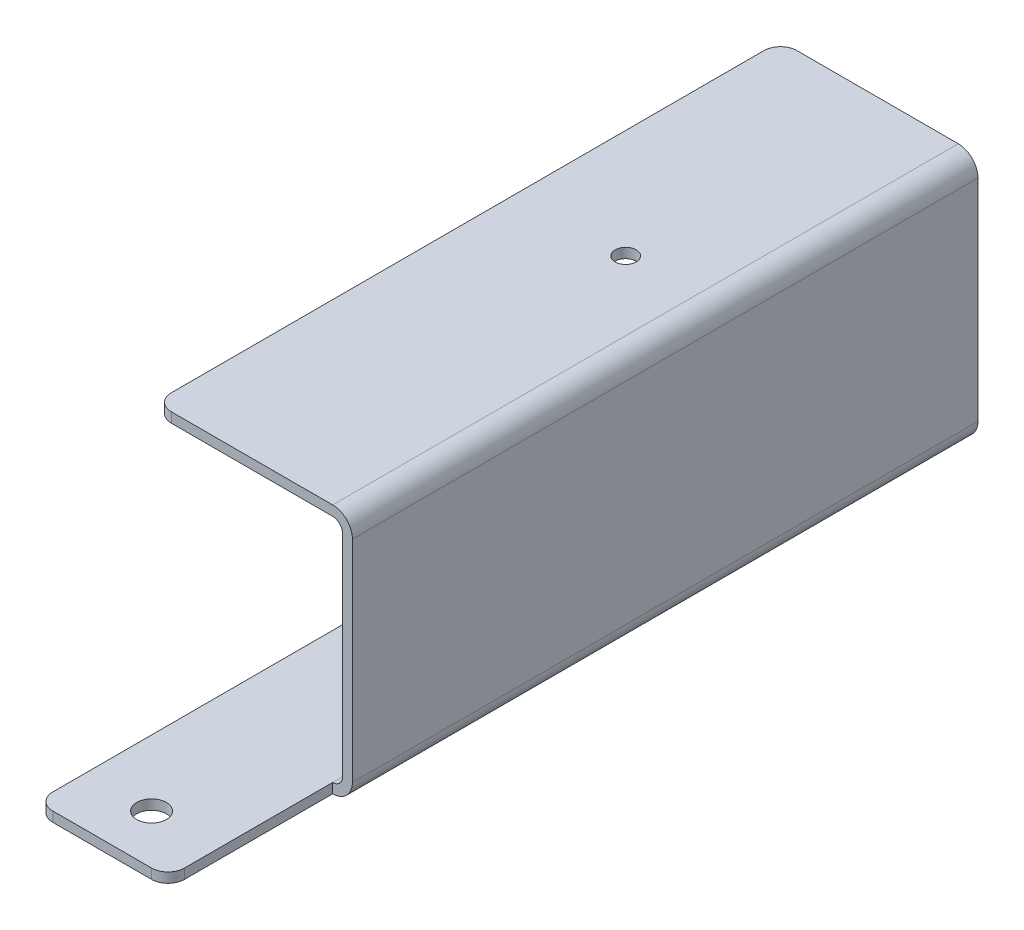
ISO-10303-21;
HEADER;
FILE_DESCRIPTION(('STEP AP214'),'2;1');
FILE_NAME('part.step','',(''),(''),'','','');
FILE_SCHEMA(('AUTOMOTIVE_DESIGN { 1 0 10303 214 1 1 1 1 }'));
ENDSEC;
DATA;
#1=APPLICATION_CONTEXT('core data for automotive mechanical design processes');
#2=APPLICATION_PROTOCOL_DEFINITION('international standard','automotive_design',2000,#1);
#3=PRODUCT_CONTEXT('',#1,'mechanical');
#4=PRODUCT('Part','Part','',(#3));
#5=PRODUCT_RELATED_PRODUCT_CATEGORY('part','',(#4));
#6=PRODUCT_DEFINITION_FORMATION('','',#4);
#7=PRODUCT_DEFINITION_CONTEXT('part definition',#1,'design');
#8=PRODUCT_DEFINITION('design','',#6,#7);
#9=PRODUCT_DEFINITION_SHAPE('','',#8);
#10=(LENGTH_UNIT() NAMED_UNIT(*) SI_UNIT(.MILLI.,.METRE.));
#11=(NAMED_UNIT(*) PLANE_ANGLE_UNIT() SI_UNIT($,.RADIAN.));
#12=(NAMED_UNIT(*) SI_UNIT($,.STERADIAN.) SOLID_ANGLE_UNIT());
#13=UNCERTAINTY_MEASURE_WITH_UNIT(LENGTH_MEASURE(1.E-05),#10,'distance_accuracy_value','');
#14=(GEOMETRIC_REPRESENTATION_CONTEXT(3) GLOBAL_UNCERTAINTY_ASSIGNED_CONTEXT((#13)) GLOBAL_UNIT_ASSIGNED_CONTEXT((#10,
#11,#12)) REPRESENTATION_CONTEXT('',''));
#15=CARTESIAN_POINT('',(0.,0.,0.));
#16=DIRECTION('',(0.,0.,1.));
#17=DIRECTION('',(1.,0.,0.));
#18=AXIS2_PLACEMENT_3D('',#15,#16,#17);
#19=CARTESIAN_POINT('',(13.,0.,-60.));
#20=DIRECTION('',(0.,0.,1.));
#21=DIRECTION('',(-1.,0.,0.));
#22=AXIS2_PLACEMENT_3D('',#19,#20,#21);
#23=PLANE('',#22);
#24=DIRECTION('',(1.,0.,0.));
#25=VECTOR('',#24,1.);
#26=CARTESIAN_POINT('',(11.5000000000001,33.5,-60.));
#27=LINE('',#26,#25);
#28=CARTESIAN_POINT('',(11.5000000000001,33.5,-60.));
#29=VERTEX_POINT('',#28);
#30=CARTESIAN_POINT('',(13.0000000000001,33.5,-60.));
#31=VERTEX_POINT('',#30);
#32=EDGE_CURVE('E306',#29,#31,#27,.T.);
#33=ORIENTED_EDGE('',*,*,#32,.T.);
#34=DIRECTION('',(0.,-1.,0.));
#35=VECTOR('',#34,1.);
#36=CARTESIAN_POINT('',(13.,0.,-60.));
#37=LINE('',#36,#35);
#38=CARTESIAN_POINT('',(13.,1.49999999999999,-60.));
#39=VERTEX_POINT('',#38);
#40=EDGE_CURVE('E314',#31,#39,#37,.T.);
#41=ORIENTED_EDGE('',*,*,#40,.T.);
#42=DIRECTION('',(-1.,0.,0.));
#43=VECTOR('',#42,1.);
#44=CARTESIAN_POINT('',(13.,1.49999999999999,-60.));
#45=LINE('',#44,#43);
#46=CARTESIAN_POINT('',(11.5,1.49999999999999,-60.));
#47=VERTEX_POINT('',#46);
#48=EDGE_CURVE('E313',#47,#39,#45,.F.);
#49=ORIENTED_EDGE('',*,*,#48,.F.);
#50=DIRECTION('',(0.,1.,0.));
#51=VECTOR('',#50,1.);
#52=CARTESIAN_POINT('',(11.5,0.,-60.));
#53=LINE('',#52,#51);
#54=EDGE_CURVE('E318',#29,#47,#53,.F.);
#55=ORIENTED_EDGE('',*,*,#54,.F.);
#56=EDGE_LOOP('',(#33,#41,#49,#55));
#57=FACE_BOUND('',#56,.T.);
#58=ADVANCED_FACE('F41',(#57),#23,.F.);
#59=CARTESIAN_POINT('',(13.,0.,0.));
#60=DIRECTION('',(-1.,0.,0.));
#61=DIRECTION('',(0.,1.,0.));
#62=AXIS2_PLACEMENT_3D('',#59,#60,#61);
#63=PLANE('',#62);
#64=DIRECTION('',(0.,0.,1.));
#65=VECTOR('',#64,1.);
#66=CARTESIAN_POINT('',(13.,1.49999999999999,-60.));
#67=LINE('',#66,#65);
#68=CARTESIAN_POINT('',(13.0000000000001,1.5,35.));
#69=VERTEX_POINT('',#68);
#70=EDGE_CURVE('E321',#69,#39,#67,.F.);
#71=ORIENTED_EDGE('',*,*,#70,.T.);
#72=ORIENTED_EDGE('',*,*,#40,.F.);
#73=DIRECTION('',(0.,0.,1.));
#74=VECTOR('',#73,1.);
#75=CARTESIAN_POINT('',(13.0000000000001,33.5,60.));
#76=LINE('',#75,#74);
#77=CARTESIAN_POINT('',(13.0000000000001,33.5,35.));
#78=VERTEX_POINT('',#77);
#79=EDGE_CURVE('E299',#78,#31,#76,.F.);
#80=ORIENTED_EDGE('',*,*,#79,.F.);
#81=DIRECTION('',(0.,1.,0.));
#82=VECTOR('',#81,1.);
#83=CARTESIAN_POINT('',(13.0000000000001,0.,35.));
#84=LINE('',#83,#82);
#85=EDGE_CURVE('E258',#69,#78,#84,.T.);
#86=ORIENTED_EDGE('',*,*,#85,.F.);
#87=EDGE_LOOP('',(#71,#72,#80,#86));
#88=FACE_BOUND('',#87,.T.);
#89=ADVANCED_FACE('F460',(#88),#63,.F.);
#90=CARTESIAN_POINT('',(11.5,0.,0.));
#91=DIRECTION('',(-1.,0.,0.));
#92=DIRECTION('',(0.,1.,0.));
#93=AXIS2_PLACEMENT_3D('',#90,#91,#92);
#94=PLANE('',#93);
#95=DIRECTION('',(0.,1.,0.));
#96=VECTOR('',#95,1.);
#97=CARTESIAN_POINT('',(11.5,0.,35.));
#98=LINE('',#97,#96);
#99=CARTESIAN_POINT('',(11.5,1.49999999999999,35.));
#100=VERTEX_POINT('',#99);
#101=CARTESIAN_POINT('',(11.5000000000001,33.5,35.));
#102=VERTEX_POINT('',#101);
#103=EDGE_CURVE('E268',#100,#102,#98,.T.);
#104=ORIENTED_EDGE('',*,*,#103,.T.);
#105=DIRECTION('',(0.,0.,1.));
#106=VECTOR('',#105,1.);
#107=CARTESIAN_POINT('',(11.5000000000001,33.5,60.));
#108=LINE('',#107,#106);
#109=EDGE_CURVE('E295',#102,#29,#108,.F.);
#110=ORIENTED_EDGE('',*,*,#109,.T.);
#111=ORIENTED_EDGE('',*,*,#54,.T.);
#112=DIRECTION('',(0.,0.,1.));
#113=VECTOR('',#112,1.);
#114=CARTESIAN_POINT('',(11.5,1.49999999999999,-60.));
#115=LINE('',#114,#113);
#116=EDGE_CURVE('E324',#47,#100,#115,.T.);
#117=ORIENTED_EDGE('',*,*,#116,.T.);
#118=EDGE_LOOP('',(#104,#110,#111,#117));
#119=FACE_BOUND('',#118,.T.);
#120=ADVANCED_FACE('F435',(#119),#94,.T.);
#121=CARTESIAN_POINT('',(-10.,-1.5,60.));
#122=DIRECTION('',(-1.,0.,0.));
#123=DIRECTION('',(0.,0.,-1.));
#124=AXIS2_PLACEMENT_3D('',#121,#122,#123);
#125=PLANE('',#124);
#126=DIRECTION('',(0.,0.,-1.));
#127=VECTOR('',#126,1.);
#128=CARTESIAN_POINT('',(-10.,0.,60.));
#129=LINE('',#128,#127);
#130=CARTESIAN_POINT('',(-10.,0.,57.5));
#131=VERTEX_POINT('',#130);
#132=CARTESIAN_POINT('',(-10.,0.,-60.));
#133=VERTEX_POINT('',#132);
#134=EDGE_CURVE('E352',#131,#133,#129,.T.);
#135=ORIENTED_EDGE('',*,*,#134,.T.);
#136=DIRECTION('',(0.,1.,0.));
#137=VECTOR('',#136,1.);
#138=CARTESIAN_POINT('',(-10.,-1.5,-60.));
#139=LINE('',#138,#137);
#140=CARTESIAN_POINT('',(-10.,-1.5,-60.));
#141=VERTEX_POINT('',#140);
#142=EDGE_CURVE('E346',#141,#133,#139,.T.);
#143=ORIENTED_EDGE('',*,*,#142,.F.);
#144=DIRECTION('',(0.,0.,-1.));
#145=VECTOR('',#144,1.);
#146=CARTESIAN_POINT('',(-10.,-1.5,60.));
#147=LINE('',#146,#145);
#148=CARTESIAN_POINT('',(-10.,-1.5,57.5));
#149=VERTEX_POINT('',#148);
#150=EDGE_CURVE('E340',#149,#141,#147,.T.);
#151=ORIENTED_EDGE('',*,*,#150,.F.);
#152=DIRECTION('',(0.,1.,0.));
#153=VECTOR('',#152,1.);
#154=CARTESIAN_POINT('',(-10.,-1.5,57.5));
#155=LINE('',#154,#153);
#156=EDGE_CURVE('E377',#131,#149,#155,.F.);
#157=ORIENTED_EDGE('',*,*,#156,.F.);
#158=EDGE_LOOP('',(#135,#143,#151,#157));
#159=FACE_BOUND('',#158,.T.);
#160=ADVANCED_FACE('F486',(#159),#125,.T.);
#161=CARTESIAN_POINT('',(-10.,-1.5,60.));
#162=DIRECTION('',(0.,0.,1.));
#163=DIRECTION('',(-1.,0.,0.));
#164=AXIS2_PLACEMENT_3D('',#161,#162,#163);
#165=PLANE('',#164);
#166=DIRECTION('',(-1.,0.,0.));
#167=VECTOR('',#166,1.);
#168=CARTESIAN_POINT('',(-10.,0.,60.));
#169=LINE('',#168,#167);
#170=CARTESIAN_POINT('',(7.5,0.,60.));
#171=VERTEX_POINT('',#170);
#172=CARTESIAN_POINT('',(-7.5,0.,60.));
#173=VERTEX_POINT('',#172);
#174=EDGE_CURVE('E349',#171,#173,#169,.T.);
#175=ORIENTED_EDGE('',*,*,#174,.T.);
#176=DIRECTION('',(0.,1.,0.));
#177=VECTOR('',#176,1.);
#178=CARTESIAN_POINT('',(-7.5,-1.5,60.));
#179=LINE('',#178,#177);
#180=CARTESIAN_POINT('',(-7.5,-1.5,60.));
#181=VERTEX_POINT('',#180);
#182=EDGE_CURVE('E366',#181,#173,#179,.T.);
#183=ORIENTED_EDGE('',*,*,#182,.F.);
#184=DIRECTION('',(-1.,0.,0.));
#185=VECTOR('',#184,1.);
#186=CARTESIAN_POINT('',(-10.,-1.5,60.));
#187=LINE('',#186,#185);
#188=CARTESIAN_POINT('',(7.5,-1.5,60.));
#189=VERTEX_POINT('',#188);
#190=EDGE_CURVE('E336',#189,#181,#187,.T.);
#191=ORIENTED_EDGE('',*,*,#190,.F.);
#192=DIRECTION('',(0.,1.,0.));
#193=VECTOR('',#192,1.);
#194=CARTESIAN_POINT('',(7.5,-1.5,60.));
#195=LINE('',#194,#193);
#196=EDGE_CURVE('E369',#171,#189,#195,.F.);
#197=ORIENTED_EDGE('',*,*,#196,.F.);
#198=EDGE_LOOP('',(#175,#183,#191,#197));
#199=FACE_BOUND('',#198,.T.);
#200=ADVANCED_FACE('F481',(#199),#165,.T.);
#201=CARTESIAN_POINT('',(0.,-1.5,0.));
#202=DIRECTION('',(0.,1.,0.));
#203=DIRECTION('',(0.,0.,1.));
#204=AXIS2_PLACEMENT_3D('',#201,#202,#203);
#205=PLANE('',#204);
#206=CARTESIAN_POINT('',(0.,-1.5,52.5));
#207=DIRECTION('',(0.,-1.,0.));
#208=DIRECTION('',(0.,0.,1.));
#209=AXIS2_PLACEMENT_3D('',#206,#207,#208);
#210=CIRCLE('',#209,2.25);
#211=CARTESIAN_POINT('',(0.,-1.5,54.75));
#212=VERTEX_POINT('',#211);
#213=EDGE_CURVE('E245',#212,#212,#210,.T.);
#214=ORIENTED_EDGE('',*,*,#213,.F.);
#215=EDGE_LOOP('',(#214));
#216=FACE_BOUND('',#215,.T.);
#217=ORIENTED_EDGE('',*,*,#190,.T.);
#218=CARTESIAN_POINT('',(-7.5,-1.5,57.5));
#219=DIRECTION('',(0.,-1.,0.));
#220=DIRECTION('',(0.,0.,1.));
#221=AXIS2_PLACEMENT_3D('',#218,#219,#220);
#222=CIRCLE('',#221,2.5);
#223=EDGE_CURVE('E372',#149,#181,#222,.F.);
#224=ORIENTED_EDGE('',*,*,#223,.F.);
#225=ORIENTED_EDGE('',*,*,#150,.T.);
#226=DIRECTION('',(1.,0.,0.));
#227=VECTOR('',#226,1.);
#228=CARTESIAN_POINT('',(-10.,-1.5,-60.));
#229=LINE('',#228,#227);
#230=CARTESIAN_POINT('',(10.,-1.50000000000002,-60.));
#231=VERTEX_POINT('',#230);
#232=EDGE_CURVE('E343',#141,#231,#229,.T.);
#233=ORIENTED_EDGE('',*,*,#232,.T.);
#234=DIRECTION('',(0.,0.,1.));
#235=VECTOR('',#234,1.);
#236=CARTESIAN_POINT('',(10.,-1.5,60.));
#237=LINE('',#236,#235);
#238=CARTESIAN_POINT('',(10.,-1.5,35.));
#239=VERTEX_POINT('',#238);
#240=EDGE_CURVE('E333',#231,#239,#237,.T.);
#241=ORIENTED_EDGE('',*,*,#240,.T.);
#242=DIRECTION('',(0.,0.,-1.));
#243=VECTOR('',#242,1.);
#244=CARTESIAN_POINT('',(10.,-1.5,60.));
#245=LINE('',#244,#243);
#246=CARTESIAN_POINT('',(10.,-1.5,57.5));
#247=VERTEX_POINT('',#246);
#248=EDGE_CURVE('E248',#247,#239,#245,.T.);
#249=ORIENTED_EDGE('',*,*,#248,.F.);
#250=CARTESIAN_POINT('',(7.5,-1.5,57.5));
#251=DIRECTION('',(0.,-1.,0.));
#252=DIRECTION('',(0.,0.,1.));
#253=AXIS2_PLACEMENT_3D('',#250,#251,#252);
#254=CIRCLE('',#253,2.5);
#255=EDGE_CURVE('E374',#189,#247,#254,.F.);
#256=ORIENTED_EDGE('',*,*,#255,.F.);
#257=EDGE_LOOP('',(#217,#224,#225,#233,#241,#249,#256));
#258=FACE_BOUND('',#257,.T.);
#259=ADVANCED_FACE('F478',(#216,#258),#205,.F.);
#260=CARTESIAN_POINT('',(0.,0.,0.));
#261=DIRECTION('',(0.,1.,0.));
#262=DIRECTION('',(0.,0.,1.));
#263=AXIS2_PLACEMENT_3D('',#260,#261,#262);
#264=PLANE('',#263);
#265=CARTESIAN_POINT('',(0.,0.,52.5));
#266=DIRECTION('',(0.,-1.,0.));
#267=DIRECTION('',(0.,0.,1.));
#268=AXIS2_PLACEMENT_3D('',#265,#266,#267);
#269=CIRCLE('',#268,2.25);
#270=CARTESIAN_POINT('',(0.,0.,54.75));
#271=VERTEX_POINT('',#270);
#272=EDGE_CURVE('E237',#271,#271,#269,.T.);
#273=ORIENTED_EDGE('',*,*,#272,.T.);
#274=EDGE_LOOP('',(#273));
#275=FACE_BOUND('',#274,.T.);
#276=DIRECTION('',(0.,0.,-1.));
#277=VECTOR('',#276,1.);
#278=CARTESIAN_POINT('',(10.,0.,0.));
#279=LINE('',#278,#277);
#280=CARTESIAN_POINT('',(10.,0.,57.5));
#281=VERTEX_POINT('',#280);
#282=CARTESIAN_POINT('',(10.,0.,35.));
#283=VERTEX_POINT('',#282);
#284=EDGE_CURVE('E255',#281,#283,#279,.T.);
#285=ORIENTED_EDGE('',*,*,#284,.T.);
#286=DIRECTION('',(0.,0.,1.));
#287=VECTOR('',#286,1.);
#288=CARTESIAN_POINT('',(10.,0.,60.));
#289=LINE('',#288,#287);
#290=CARTESIAN_POINT('',(10.,0.,-60.));
#291=VERTEX_POINT('',#290);
#292=EDGE_CURVE('E331',#291,#283,#289,.T.);
#293=ORIENTED_EDGE('',*,*,#292,.F.);
#294=DIRECTION('',(1.,0.,0.));
#295=VECTOR('',#294,1.);
#296=CARTESIAN_POINT('',(-10.,0.,-60.));
#297=LINE('',#296,#295);
#298=EDGE_CURVE('E337',#133,#291,#297,.T.);
#299=ORIENTED_EDGE('',*,*,#298,.F.);
#300=ORIENTED_EDGE('',*,*,#134,.F.);
#301=CARTESIAN_POINT('',(-7.5,0.,57.5));
#302=DIRECTION('',(0.,-1.,0.));
#303=DIRECTION('',(0.,0.,1.));
#304=AXIS2_PLACEMENT_3D('',#301,#302,#303);
#305=CIRCLE('',#304,2.5);
#306=EDGE_CURVE('E362',#173,#131,#305,.T.);
#307=ORIENTED_EDGE('',*,*,#306,.F.);
#308=ORIENTED_EDGE('',*,*,#174,.F.);
#309=CARTESIAN_POINT('',(7.5,0.,57.5));
#310=DIRECTION('',(0.,-1.,0.));
#311=DIRECTION('',(0.,0.,1.));
#312=AXIS2_PLACEMENT_3D('',#309,#310,#311);
#313=CIRCLE('',#312,2.5);
#314=EDGE_CURVE('E364',#281,#171,#313,.T.);
#315=ORIENTED_EDGE('',*,*,#314,.F.);
#316=EDGE_LOOP('',(#285,#293,#299,#300,#307,#308,#315));
#317=FACE_BOUND('',#316,.T.);
#318=ADVANCED_FACE('F477',(#275,#317),#264,.T.);
#319=CARTESIAN_POINT('',(10.,1.5,-60.));
#320=DIRECTION('',(0.,0.,-1.));
#321=DIRECTION('',(1.,0.,0.));
#322=AXIS2_PLACEMENT_3D('',#319,#320,#321);
#323=PLANE('',#322);
#324=ORIENTED_EDGE('',*,*,#48,.T.);
#325=CARTESIAN_POINT('',(10.,1.5,-60.));
#326=DIRECTION('',(0.,0.,-1.));
#327=DIRECTION('',(-1.,0.,0.));
#328=AXIS2_PLACEMENT_3D('',#325,#326,#327);
#329=CIRCLE('',#328,3.);
#330=EDGE_CURVE('E329',#231,#39,#329,.F.);
#331=ORIENTED_EDGE('',*,*,#330,.F.);
#332=DIRECTION('',(0.,1.,0.));
#333=VECTOR('',#332,1.);
#334=CARTESIAN_POINT('',(10.,-1.5,-60.));
#335=LINE('',#334,#333);
#336=EDGE_CURVE('E233',#231,#291,#335,.T.);
#337=ORIENTED_EDGE('',*,*,#336,.T.);
#338=CARTESIAN_POINT('',(10.,1.5,-60.));
#339=DIRECTION('',(0.,0.,-1.));
#340=DIRECTION('',(-1.,0.,0.));
#341=AXIS2_PLACEMENT_3D('',#338,#339,#340);
#342=CIRCLE('',#341,1.5);
#343=EDGE_CURVE('E317',#291,#47,#342,.F.);
#344=ORIENTED_EDGE('',*,*,#343,.T.);
#345=EDGE_LOOP('',(#324,#331,#337,#344));
#346=FACE_BOUND('',#345,.T.);
#347=ADVANCED_FACE('F440',(#346),#323,.T.);
#348=CARTESIAN_POINT('',(10.,1.5,60.));
#349=DIRECTION('',(0.,0.,1.));
#350=DIRECTION('',(1.,0.,0.));
#351=AXIS2_PLACEMENT_3D('',#348,#349,#350);
#352=CYLINDRICAL_SURFACE('',#351,3.);
#353=ORIENTED_EDGE('',*,*,#240,.F.);
#354=ORIENTED_EDGE('',*,*,#330,.T.);
#355=ORIENTED_EDGE('',*,*,#70,.F.);
#356=CARTESIAN_POINT('',(10.,1.5,35.));
#357=DIRECTION('',(0.,0.,1.));
#358=DIRECTION('',(1.,0.,0.));
#359=AXIS2_PLACEMENT_3D('',#356,#357,#358);
#360=CIRCLE('',#359,3.);
#361=EDGE_CURVE('E276',#69,#239,#360,.F.);
#362=ORIENTED_EDGE('',*,*,#361,.T.);
#363=EDGE_LOOP('',(#353,#354,#355,#362));
#364=FACE_BOUND('',#363,.T.);
#365=ADVANCED_FACE('F469',(#364),#352,.T.);
#366=CARTESIAN_POINT('',(10.,1.5,60.));
#367=DIRECTION('',(0.,0.,1.));
#368=DIRECTION('',(1.,0.,0.));
#369=AXIS2_PLACEMENT_3D('',#366,#367,#368);
#370=CYLINDRICAL_SURFACE('',#369,1.5);
#371=ORIENTED_EDGE('',*,*,#116,.F.);
#372=ORIENTED_EDGE('',*,*,#343,.F.);
#373=ORIENTED_EDGE('',*,*,#292,.T.);
#374=CARTESIAN_POINT('',(10.,1.5,35.));
#375=DIRECTION('',(0.,0.,1.));
#376=DIRECTION('',(1.,0.,0.));
#377=AXIS2_PLACEMENT_3D('',#374,#375,#376);
#378=CIRCLE('',#377,1.5);
#379=EDGE_CURVE('E271',#100,#283,#378,.F.);
#380=ORIENTED_EDGE('',*,*,#379,.F.);
#381=EDGE_LOOP('',(#371,#372,#373,#380));
#382=FACE_BOUND('',#381,.T.);
#383=ADVANCED_FACE('F445',(#382),#370,.F.);
#384=CARTESIAN_POINT('',(10.0000000000001,33.5,-60.));
#385=DIRECTION('',(0.,0.,-1.));
#386=DIRECTION('',(1.,0.,0.));
#387=AXIS2_PLACEMENT_3D('',#384,#385,#386);
#388=PLANE('',#387);
#389=DIRECTION('',(0.,1.,0.));
#390=VECTOR('',#389,1.);
#391=CARTESIAN_POINT('',(10.0000000000001,35.,-60.));
#392=LINE('',#391,#390);
#393=CARTESIAN_POINT('',(10.0000000000001,35.,-60.));
#394=VERTEX_POINT('',#393);
#395=CARTESIAN_POINT('',(10.0000000000001,36.5,-60.));
#396=VERTEX_POINT('',#395);
#397=EDGE_CURVE('E279',#394,#396,#392,.T.);
#398=ORIENTED_EDGE('',*,*,#397,.T.);
#399=CARTESIAN_POINT('',(10.0000000000001,33.5,-60.));
#400=DIRECTION('',(0.,0.,-1.));
#401=DIRECTION('',(-1.,0.,0.));
#402=AXIS2_PLACEMENT_3D('',#399,#400,#401);
#403=CIRCLE('',#402,3.);
#404=EDGE_CURVE('E302',#31,#396,#403,.F.);
#405=ORIENTED_EDGE('',*,*,#404,.F.);
#406=ORIENTED_EDGE('',*,*,#32,.F.);
#407=CARTESIAN_POINT('',(10.0000000000001,33.5,-60.));
#408=DIRECTION('',(0.,0.,-1.));
#409=DIRECTION('',(-1.,0.,0.));
#410=AXIS2_PLACEMENT_3D('',#407,#408,#409);
#411=CIRCLE('',#410,1.5);
#412=EDGE_CURVE('E303',#29,#394,#411,.F.);
#413=ORIENTED_EDGE('',*,*,#412,.T.);
#414=EDGE_LOOP('',(#398,#405,#406,#413));
#415=FACE_BOUND('',#414,.T.);
#416=ADVANCED_FACE('F427',(#415),#388,.T.);
#417=CARTESIAN_POINT('',(10.0000000000001,33.5,60.));
#418=DIRECTION('',(0.,0.,1.));
#419=DIRECTION('',(0.,1.,0.));
#420=AXIS2_PLACEMENT_3D('',#417,#418,#419);
#421=CYLINDRICAL_SURFACE('',#420,3.);
#422=CARTESIAN_POINT('',(10.0000000000001,33.5,35.));
#423=DIRECTION('',(0.,0.,1.));
#424=DIRECTION('',(1.,0.,0.));
#425=AXIS2_PLACEMENT_3D('',#422,#423,#424);
#426=CIRCLE('',#425,3.);
#427=CARTESIAN_POINT('',(10.0000000000001,36.5000000000002,35.));
#428=VERTEX_POINT('',#427);
#429=EDGE_CURVE('E274',#428,#78,#426,.F.);
#430=ORIENTED_EDGE('',*,*,#429,.T.);
#431=ORIENTED_EDGE('',*,*,#79,.T.);
#432=ORIENTED_EDGE('',*,*,#404,.T.);
#433=DIRECTION('',(0.,0.,-1.));
#434=VECTOR('',#433,1.);
#435=CARTESIAN_POINT('',(10.0000000000001,36.5,0.));
#436=LINE('',#435,#434);
#437=EDGE_CURVE('E283',#428,#396,#436,.T.);
#438=ORIENTED_EDGE('',*,*,#437,.F.);
#439=EDGE_LOOP('',(#430,#431,#432,#438));
#440=FACE_BOUND('',#439,.T.);
#441=ADVANCED_FACE('F422',(#440),#421,.T.);
#442=CARTESIAN_POINT('',(10.0000000000001,33.5,60.));
#443=DIRECTION('',(0.,0.,1.));
#444=DIRECTION('',(0.,1.,0.));
#445=AXIS2_PLACEMENT_3D('',#442,#443,#444);
#446=CYLINDRICAL_SURFACE('',#445,1.5);
#447=DIRECTION('',(0.,0.,1.));
#448=VECTOR('',#447,1.);
#449=CARTESIAN_POINT('',(10.0000000000001,35.,-60.));
#450=LINE('',#449,#448);
#451=CARTESIAN_POINT('',(10.0000000000001,35.,35.));
#452=VERTEX_POINT('',#451);
#453=EDGE_CURVE('E280',#394,#452,#450,.T.);
#454=ORIENTED_EDGE('',*,*,#453,.F.);
#455=ORIENTED_EDGE('',*,*,#412,.F.);
#456=ORIENTED_EDGE('',*,*,#109,.F.);
#457=CARTESIAN_POINT('',(10.0000000000001,33.5,35.));
#458=DIRECTION('',(0.,0.,1.));
#459=DIRECTION('',(1.,0.,0.));
#460=AXIS2_PLACEMENT_3D('',#457,#458,#459);
#461=CIRCLE('',#460,1.5);
#462=EDGE_CURVE('E266',#452,#102,#461,.F.);
#463=ORIENTED_EDGE('',*,*,#462,.F.);
#464=EDGE_LOOP('',(#454,#455,#456,#463));
#465=FACE_BOUND('',#464,.T.);
#466=ADVANCED_FACE('F431',(#465),#446,.F.);
#467=CARTESIAN_POINT('',(11.5000000000001,36.5,-60.));
#468=DIRECTION('',(0.,0.,1.));
#469=DIRECTION('',(-1.,0.,0.));
#470=AXIS2_PLACEMENT_3D('',#467,#468,#469);
#471=PLANE('',#470);
#472=DIRECTION('',(1.,0.,0.));
#473=VECTOR('',#472,1.);
#474=CARTESIAN_POINT('',(11.5000000000001,36.5,-60.));
#475=LINE('',#474,#473);
#476=CARTESIAN_POINT('',(-14.4999999999999,36.5000000000002,-60.));
#477=VERTEX_POINT('',#476);
#478=EDGE_CURVE('E292',#477,#396,#475,.T.);
#479=ORIENTED_EDGE('',*,*,#478,.T.);
#480=ORIENTED_EDGE('',*,*,#397,.F.);
#481=DIRECTION('',(1.,0.,0.));
#482=VECTOR('',#481,1.);
#483=CARTESIAN_POINT('',(11.5000000000001,35.,-60.));
#484=LINE('',#483,#482);
#485=CARTESIAN_POINT('',(-14.4999999999999,35.0000000000002,-60.));
#486=VERTEX_POINT('',#485);
#487=EDGE_CURVE('E293',#486,#394,#484,.T.);
#488=ORIENTED_EDGE('',*,*,#487,.F.);
#489=DIRECTION('',(0.,-1.,0.));
#490=VECTOR('',#489,1.);
#491=CARTESIAN_POINT('',(-14.4999999999999,36.5000000000002,-60.));
#492=LINE('',#491,#490);
#493=EDGE_CURVE('E397',#477,#486,#492,.T.);
#494=ORIENTED_EDGE('',*,*,#493,.F.);
#495=EDGE_LOOP('',(#479,#480,#488,#494));
#496=FACE_BOUND('',#495,.T.);
#497=ADVANCED_FACE('F415',(#496),#471,.F.);
#498=CARTESIAN_POINT('',(2.57563403399909E-13,36.5000000000001,0.));
#499=DIRECTION('',(0.,-1.,0.));
#500=DIRECTION('',(-1.,0.,0.));
#501=AXIS2_PLACEMENT_3D('',#498,#499,#500);
#502=PLANE('',#501);
#503=CARTESIAN_POINT('',(-0.499999999999739,36.5000000000001,-20.));
#504=DIRECTION('',(0.,-1.,0.));
#505=DIRECTION('',(1.,0.,0.));
#506=AXIS2_PLACEMENT_3D('',#503,#504,#505);
#507=CIRCLE('',#506,1.6);
#508=CARTESIAN_POINT('',(1.10000000000026,36.5000000000001,-20.));
#509=VERTEX_POINT('',#508);
#510=EDGE_CURVE('E526',#509,#509,#507,.T.);
#511=ORIENTED_EDGE('',*,*,#510,.T.);
#512=EDGE_LOOP('',(#511));
#513=FACE_BOUND('',#512,.T.);
#514=DIRECTION('',(0.,0.,-1.));
#515=VECTOR('',#514,1.);
#516=CARTESIAN_POINT('',(-16.9999999999999,36.5000000000002,-60.));
#517=LINE('',#516,#515);
#518=CARTESIAN_POINT('',(-16.9999999999999,36.5000000000002,32.5));
#519=VERTEX_POINT('',#518);
#520=CARTESIAN_POINT('',(-16.9999999999999,36.5000000000002,-57.5));
#521=VERTEX_POINT('',#520);
#522=EDGE_CURVE('E289',#519,#521,#517,.T.);
#523=ORIENTED_EDGE('',*,*,#522,.F.);
#524=CARTESIAN_POINT('',(-14.4999999999999,36.5000000000002,32.5));
#525=DIRECTION('',(0.,1.,0.));
#526=DIRECTION('',(-1.,0.,0.));
#527=AXIS2_PLACEMENT_3D('',#524,#525,#526);
#528=CIRCLE('',#527,2.5);
#529=CARTESIAN_POINT('',(-14.4999999999999,36.5000000000002,35.));
#530=VERTEX_POINT('',#529);
#531=EDGE_CURVE('E407',#530,#519,#528,.F.);
#532=ORIENTED_EDGE('',*,*,#531,.F.);
#533=DIRECTION('',(-1.,0.,0.));
#534=VECTOR('',#533,1.);
#535=CARTESIAN_POINT('',(13.0000000000001,36.5000000000002,35.));
#536=LINE('',#535,#534);
#537=EDGE_CURVE('E261',#428,#530,#536,.T.);
#538=ORIENTED_EDGE('',*,*,#537,.F.);
#539=ORIENTED_EDGE('',*,*,#437,.T.);
#540=ORIENTED_EDGE('',*,*,#478,.F.);
#541=CARTESIAN_POINT('',(-14.4999999999999,36.5000000000002,-57.5));
#542=DIRECTION('',(0.,1.,0.));
#543=DIRECTION('',(-1.,0.,0.));
#544=AXIS2_PLACEMENT_3D('',#541,#542,#543);
#545=CIRCLE('',#544,2.5);
#546=EDGE_CURVE('E49',#521,#477,#545,.F.);
#547=ORIENTED_EDGE('',*,*,#546,.F.);
#548=EDGE_LOOP('',(#523,#532,#538,#539,#540,#547));
#549=FACE_BOUND('',#548,.T.);
#550=ADVANCED_FACE('F417',(#513,#549),#502,.F.);
#551=CARTESIAN_POINT('',(2.47122010963714E-13,35.0000000000001,0.));
#552=DIRECTION('',(0.,-1.,0.));
#553=DIRECTION('',(-1.,0.,0.));
#554=AXIS2_PLACEMENT_3D('',#551,#552,#553);
#555=PLANE('',#554);
#556=CARTESIAN_POINT('',(-0.49999999999975,35.0000000000001,-20.));
#557=DIRECTION('',(0.,1.,0.));
#558=DIRECTION('',(-1.,0.,0.));
#559=AXIS2_PLACEMENT_3D('',#556,#557,#558);
#560=CIRCLE('',#559,1.6);
#561=CARTESIAN_POINT('',(-2.09999999999975,35.0000000000001,-20.));
#562=VERTEX_POINT('',#561);
#563=EDGE_CURVE('E529',#562,#562,#560,.F.);
#564=ORIENTED_EDGE('',*,*,#563,.F.);
#565=EDGE_LOOP('',(#564));
#566=FACE_BOUND('',#565,.T.);
#567=ORIENTED_EDGE('',*,*,#487,.T.);
#568=ORIENTED_EDGE('',*,*,#453,.T.);
#569=DIRECTION('',(-1.,0.,0.));
#570=VECTOR('',#569,1.);
#571=CARTESIAN_POINT('',(2.47122010963714E-13,35.0000000000001,35.));
#572=LINE('',#571,#570);
#573=CARTESIAN_POINT('',(-14.4999999999999,35.0000000000002,35.));
#574=VERTEX_POINT('',#573);
#575=EDGE_CURVE('E263',#452,#574,#572,.T.);
#576=ORIENTED_EDGE('',*,*,#575,.T.);
#577=CARTESIAN_POINT('',(-14.4999999999999,35.0000000000002,32.5));
#578=DIRECTION('',(0.,1.,0.));
#579=DIRECTION('',(-1.,0.,0.));
#580=AXIS2_PLACEMENT_3D('',#577,#578,#579);
#581=CIRCLE('',#580,2.5);
#582=CARTESIAN_POINT('',(-16.9999999999999,35.0000000000002,32.5));
#583=VERTEX_POINT('',#582);
#584=EDGE_CURVE('E400',#583,#574,#581,.T.);
#585=ORIENTED_EDGE('',*,*,#584,.F.);
#586=DIRECTION('',(0.,0.,-1.));
#587=VECTOR('',#586,1.);
#588=CARTESIAN_POINT('',(-16.9999999999999,35.0000000000002,-60.));
#589=LINE('',#588,#587);
#590=CARTESIAN_POINT('',(-16.9999999999999,35.0000000000002,-57.5));
#591=VERTEX_POINT('',#590);
#592=EDGE_CURVE('E288',#583,#591,#589,.T.);
#593=ORIENTED_EDGE('',*,*,#592,.T.);
#594=CARTESIAN_POINT('',(-14.4999999999999,35.0000000000002,-57.5));
#595=DIRECTION('',(0.,1.,0.));
#596=DIRECTION('',(-1.,0.,0.));
#597=AXIS2_PLACEMENT_3D('',#594,#595,#596);
#598=CIRCLE('',#597,2.5);
#599=EDGE_CURVE('E402',#486,#591,#598,.T.);
#600=ORIENTED_EDGE('',*,*,#599,.F.);
#601=EDGE_LOOP('',(#567,#568,#576,#585,#593,#600));
#602=FACE_BOUND('',#601,.T.);
#603=ADVANCED_FACE('F449',(#566,#602),#555,.T.);
#604=CARTESIAN_POINT('',(-16.9999999999999,36.5000000000002,-60.));
#605=DIRECTION('',(1.,0.,0.));
#606=DIRECTION('',(0.,-1.,0.));
#607=AXIS2_PLACEMENT_3D('',#604,#605,#606);
#608=PLANE('',#607);
#609=ORIENTED_EDGE('',*,*,#592,.F.);
#610=DIRECTION('',(0.,-1.,0.));
#611=VECTOR('',#610,1.);
#612=CARTESIAN_POINT('',(-16.9999999999999,36.5000000000002,32.5));
#613=LINE('',#612,#611);
#614=EDGE_CURVE('E404',#519,#583,#613,.T.);
#615=ORIENTED_EDGE('',*,*,#614,.F.);
#616=ORIENTED_EDGE('',*,*,#522,.T.);
#617=DIRECTION('',(0.,-1.,0.));
#618=VECTOR('',#617,1.);
#619=CARTESIAN_POINT('',(-16.9999999999999,36.5000000000002,-57.5));
#620=LINE('',#619,#618);
#621=EDGE_CURVE('E62',#591,#521,#620,.F.);
#622=ORIENTED_EDGE('',*,*,#621,.F.);
#623=EDGE_LOOP('',(#609,#615,#616,#622));
#624=FACE_BOUND('',#623,.T.);
#625=ADVANCED_FACE('F453',(#624),#608,.F.);
#626=CARTESIAN_POINT('',(13.0000000000001,0.,35.));
#627=DIRECTION('',(0.,0.,-1.));
#628=DIRECTION('',(1.,0.,0.));
#629=AXIS2_PLACEMENT_3D('',#626,#627,#628);
#630=PLANE('',#629);
#631=ORIENTED_EDGE('',*,*,#575,.F.);
#632=ORIENTED_EDGE('',*,*,#462,.T.);
#633=ORIENTED_EDGE('',*,*,#103,.F.);
#634=ORIENTED_EDGE('',*,*,#379,.T.);
#635=DIRECTION('',(0.,1.,0.));
#636=VECTOR('',#635,1.);
#637=CARTESIAN_POINT('',(10.,-1.5,35.));
#638=LINE('',#637,#636);
#639=EDGE_CURVE('E253',#239,#283,#638,.T.);
#640=ORIENTED_EDGE('',*,*,#639,.F.);
#641=ORIENTED_EDGE('',*,*,#361,.F.);
#642=ORIENTED_EDGE('',*,*,#85,.T.);
#643=ORIENTED_EDGE('',*,*,#429,.F.);
#644=ORIENTED_EDGE('',*,*,#537,.T.);
#645=DIRECTION('',(0.,-1.,0.));
#646=VECTOR('',#645,1.);
#647=CARTESIAN_POINT('',(-14.5000000000001,1.91425527996912E-13,35.));
#648=LINE('',#647,#646);
#649=EDGE_CURVE('E11',#574,#530,#648,.F.);
#650=ORIENTED_EDGE('',*,*,#649,.F.);
#651=EDGE_LOOP('',(#631,#632,#633,#634,#640,#641,#642,#643,#644,#650));
#652=FACE_BOUND('',#651,.T.);
#653=ADVANCED_FACE('F447',(#652),#630,.F.);
#654=CARTESIAN_POINT('',(10.,-1.5,60.));
#655=DIRECTION('',(-1.,0.,0.));
#656=DIRECTION('',(0.,0.,-1.));
#657=AXIS2_PLACEMENT_3D('',#654,#655,#656);
#658=PLANE('',#657);
#659=ORIENTED_EDGE('',*,*,#248,.T.);
#660=ORIENTED_EDGE('',*,*,#639,.T.);
#661=ORIENTED_EDGE('',*,*,#284,.F.);
#662=DIRECTION('',(0.,1.,0.));
#663=VECTOR('',#662,1.);
#664=CARTESIAN_POINT('',(10.,0.,57.5));
#665=LINE('',#664,#663);
#666=EDGE_CURVE('E358',#247,#281,#665,.T.);
#667=ORIENTED_EDGE('',*,*,#666,.F.);
#668=EDGE_LOOP('',(#659,#660,#661,#667));
#669=FACE_BOUND('',#668,.T.);
#670=ADVANCED_FACE('F556',(#669),#658,.F.);
#671=CARTESIAN_POINT('',(0.,-1.5,52.5));
#672=DIRECTION('',(0.,1.,0.));
#673=DIRECTION('',(0.,0.,1.));
#674=AXIS2_PLACEMENT_3D('',#671,#672,#673);
#675=CYLINDRICAL_SURFACE('',#674,2.25);
#676=ORIENTED_EDGE('',*,*,#213,.T.);
#677=EDGE_LOOP('',(#676));
#678=FACE_BOUND('',#677,.T.);
#679=ORIENTED_EDGE('',*,*,#272,.F.);
#680=EDGE_LOOP('',(#679));
#681=FACE_BOUND('',#680,.T.);
#682=ADVANCED_FACE('F565',(#678,#681),#675,.F.);
#683=CARTESIAN_POINT('',(-10.,1.49999999999998,-60.));
#684=DIRECTION('',(-1.,0.,0.));
#685=DIRECTION('',(0.,0.,-1.));
#686=AXIS2_PLACEMENT_3D('',#683,#684,#685);
#687=PLANE('',#686);
#688=DIRECTION('',(0.,0.,1.));
#689=VECTOR('',#688,1.);
#690=CARTESIAN_POINT('',(-10.,1.5,-63.));
#691=LINE('',#690,#689);
#692=CARTESIAN_POINT('',(-10.,1.49999999999998,-61.5));
#693=VERTEX_POINT('',#692);
#694=CARTESIAN_POINT('',(-10.,1.49999999999997,-63.));
#695=VERTEX_POINT('',#694);
#696=EDGE_CURVE('E525',#693,#695,#691,.F.);
#697=ORIENTED_EDGE('',*,*,#696,.T.);
#698=CARTESIAN_POINT('',(-10.,1.49999999999998,-60.));
#699=DIRECTION('',(-1.,0.,0.));
#700=DIRECTION('',(0.,0.,1.));
#701=AXIS2_PLACEMENT_3D('',#698,#699,#700);
#702=CIRCLE('',#701,3.);
#703=EDGE_CURVE('E217',#141,#695,#702,.F.);
#704=ORIENTED_EDGE('',*,*,#703,.F.);
#705=ORIENTED_EDGE('',*,*,#142,.T.);
#706=CARTESIAN_POINT('',(-10.,1.49999999999998,-60.));
#707=DIRECTION('',(-1.,0.,0.));
#708=DIRECTION('',(0.,0.,1.));
#709=AXIS2_PLACEMENT_3D('',#706,#707,#708);
#710=CIRCLE('',#709,1.5);
#711=EDGE_CURVE('E235',#133,#693,#710,.F.);
#712=ORIENTED_EDGE('',*,*,#711,.T.);
#713=EDGE_LOOP('',(#697,#704,#705,#712));
#714=FACE_BOUND('',#713,.T.);
#715=ADVANCED_FACE('F545',(#714),#687,.T.);
#716=CARTESIAN_POINT('',(10.,1.49999999999998,-60.));
#717=DIRECTION('',(-1.,0.,0.));
#718=DIRECTION('',(0.,0.,-1.));
#719=AXIS2_PLACEMENT_3D('',#716,#717,#718);
#720=PLANE('',#719);
#721=CARTESIAN_POINT('',(10.,1.49999999999998,-60.));
#722=DIRECTION('',(-1.,0.,0.));
#723=DIRECTION('',(0.,0.,1.));
#724=AXIS2_PLACEMENT_3D('',#721,#722,#723);
#725=CIRCLE('',#724,1.5);
#726=CARTESIAN_POINT('',(10.,1.49999999999998,-61.5));
#727=VERTEX_POINT('',#726);
#728=EDGE_CURVE('E240',#727,#291,#725,.T.);
#729=ORIENTED_EDGE('',*,*,#728,.T.);
#730=ORIENTED_EDGE('',*,*,#336,.F.);
#731=CARTESIAN_POINT('',(10.,1.49999999999998,-60.));
#732=DIRECTION('',(-1.,0.,0.));
#733=DIRECTION('',(0.,0.,1.));
#734=AXIS2_PLACEMENT_3D('',#731,#732,#733);
#735=CIRCLE('',#734,3.);
#736=CARTESIAN_POINT('',(10.,1.5,-63.));
#737=VERTEX_POINT('',#736);
#738=EDGE_CURVE('E215',#737,#231,#735,.T.);
#739=ORIENTED_EDGE('',*,*,#738,.F.);
#740=DIRECTION('',(0.,0.,1.));
#741=VECTOR('',#740,1.);
#742=CARTESIAN_POINT('',(10.,1.49999999999999,-61.5));
#743=LINE('',#742,#741);
#744=EDGE_CURVE('E220',#727,#737,#743,.F.);
#745=ORIENTED_EDGE('',*,*,#744,.F.);
#746=EDGE_LOOP('',(#729,#730,#739,#745));
#747=FACE_BOUND('',#746,.T.);
#748=ADVANCED_FACE('F231',(#747),#720,.F.);
#749=CARTESIAN_POINT('',(10.,1.49999999999998,-60.));
#750=DIRECTION('',(1.,0.,0.));
#751=DIRECTION('',(0.,0.,-1.));
#752=AXIS2_PLACEMENT_3D('',#749,#750,#751);
#753=CYLINDRICAL_SURFACE('',#752,3.);
#754=ORIENTED_EDGE('',*,*,#232,.F.);
#755=ORIENTED_EDGE('',*,*,#703,.T.);
#756=DIRECTION('',(1.,0.,0.));
#757=VECTOR('',#756,1.);
#758=CARTESIAN_POINT('',(-10.,1.5,-63.));
#759=LINE('',#758,#757);
#760=EDGE_CURVE('E199',#737,#695,#759,.F.);
#761=ORIENTED_EDGE('',*,*,#760,.F.);
#762=ORIENTED_EDGE('',*,*,#738,.T.);
#763=EDGE_LOOP('',(#754,#755,#761,#762));
#764=FACE_BOUND('',#763,.T.);
#765=ADVANCED_FACE('F213',(#764),#753,.T.);
#766=CARTESIAN_POINT('',(10.,1.49999999999998,-60.));
#767=DIRECTION('',(1.,0.,0.));
#768=DIRECTION('',(0.,0.,-1.));
#769=AXIS2_PLACEMENT_3D('',#766,#767,#768);
#770=CYLINDRICAL_SURFACE('',#769,1.5);
#771=ORIENTED_EDGE('',*,*,#298,.T.);
#772=ORIENTED_EDGE('',*,*,#728,.F.);
#773=DIRECTION('',(1.,0.,0.));
#774=VECTOR('',#773,1.);
#775=CARTESIAN_POINT('',(-10.,1.49999999999999,-61.5));
#776=LINE('',#775,#774);
#777=EDGE_CURVE('E229',#693,#727,#776,.T.);
#778=ORIENTED_EDGE('',*,*,#777,.F.);
#779=ORIENTED_EDGE('',*,*,#711,.F.);
#780=EDGE_LOOP('',(#771,#772,#778,#779));
#781=FACE_BOUND('',#780,.T.);
#782=ADVANCED_FACE('F543',(#781),#770,.F.);
#783=CARTESIAN_POINT('',(-10.,0.,-63.));
#784=DIRECTION('',(1.,0.,0.));
#785=DIRECTION('',(0.,0.,1.));
#786=AXIS2_PLACEMENT_3D('',#783,#784,#785);
#787=PLANE('',#786);
#788=DIRECTION('',(0.,-1.,0.));
#789=VECTOR('',#788,1.);
#790=CARTESIAN_POINT('',(-10.,-2.07777908933124E-13,-63.));
#791=LINE('',#790,#789);
#792=CARTESIAN_POINT('',(-10.,16.,-63.0000000000001));
#793=VERTEX_POINT('',#792);
#794=EDGE_CURVE('E209',#793,#695,#791,.T.);
#795=ORIENTED_EDGE('',*,*,#794,.T.);
#796=ORIENTED_EDGE('',*,*,#696,.F.);
#797=DIRECTION('',(0.,1.,0.));
#798=VECTOR('',#797,1.);
#799=CARTESIAN_POINT('',(-10.,0.,-61.5));
#800=LINE('',#799,#798);
#801=CARTESIAN_POINT('',(-10.,16.,-61.5000000000001));
#802=VERTEX_POINT('',#801);
#803=EDGE_CURVE('E219',#802,#693,#800,.F.);
#804=ORIENTED_EDGE('',*,*,#803,.F.);
#805=DIRECTION('',(0.,0.,1.));
#806=VECTOR('',#805,1.);
#807=CARTESIAN_POINT('',(-10.,16.,-63.0000000000001));
#808=LINE('',#807,#806);
#809=EDGE_CURVE('E394',#793,#802,#808,.T.);
#810=ORIENTED_EDGE('',*,*,#809,.F.);
#811=EDGE_LOOP('',(#795,#796,#804,#810));
#812=FACE_BOUND('',#811,.T.);
#813=ADVANCED_FACE('F515',(#812),#787,.F.);
#814=CARTESIAN_POINT('',(10.,18.5,-63.0000000000001));
#815=DIRECTION('',(-1.,0.,0.));
#816=DIRECTION('',(0.,0.,-1.));
#817=AXIS2_PLACEMENT_3D('',#814,#815,#816);
#818=PLANE('',#817);
#819=DIRECTION('',(0.,-1.,0.));
#820=VECTOR('',#819,1.);
#821=CARTESIAN_POINT('',(10.,18.5,-61.5000000000001));
#822=LINE('',#821,#820);
#823=CARTESIAN_POINT('',(10.,16.,-61.5000000000001));
#824=VERTEX_POINT('',#823);
#825=EDGE_CURVE('E225',#727,#824,#822,.F.);
#826=ORIENTED_EDGE('',*,*,#825,.F.);
#827=ORIENTED_EDGE('',*,*,#744,.T.);
#828=DIRECTION('',(0.,1.,0.));
#829=VECTOR('',#828,1.);
#830=CARTESIAN_POINT('',(10.,-2.07777908933124E-13,-63.));
#831=LINE('',#830,#829);
#832=CARTESIAN_POINT('',(10.,16.,-63.0000000000001));
#833=VERTEX_POINT('',#832);
#834=EDGE_CURVE('E195',#737,#833,#831,.T.);
#835=ORIENTED_EDGE('',*,*,#834,.T.);
#836=DIRECTION('',(0.,0.,1.));
#837=VECTOR('',#836,1.);
#838=CARTESIAN_POINT('',(10.,16.,-63.0000000000001));
#839=LINE('',#838,#837);
#840=EDGE_CURVE('E389',#824,#833,#839,.F.);
#841=ORIENTED_EDGE('',*,*,#840,.F.);
#842=EDGE_LOOP('',(#826,#827,#835,#841));
#843=FACE_BOUND('',#842,.T.);
#844=ADVANCED_FACE('F223',(#843),#818,.F.);
#845=CARTESIAN_POINT('',(0.,-2.07777908933124E-13,-63.));
#846=DIRECTION('',(0.,0.,1.));
#847=DIRECTION('',(0.,-1.,0.));
#848=AXIS2_PLACEMENT_3D('',#845,#846,#847);
#849=PLANE('',#848);
#850=ORIENTED_EDGE('',*,*,#834,.F.);
#851=ORIENTED_EDGE('',*,*,#760,.T.);
#852=ORIENTED_EDGE('',*,*,#794,.F.);
#853=CARTESIAN_POINT('',(-7.5,16.,-63.0000000000001));
#854=DIRECTION('',(0.,0.,-1.));
#855=DIRECTION('',(0.,-1.,0.));
#856=AXIS2_PLACEMENT_3D('',#853,#854,#855);
#857=CIRCLE('',#856,2.5);
#858=CARTESIAN_POINT('',(-7.5,18.5,-63.0000000000001));
#859=VERTEX_POINT('',#858);
#860=EDGE_CURVE('E391',#859,#793,#857,.F.);
#861=ORIENTED_EDGE('',*,*,#860,.F.);
#862=DIRECTION('',(-1.,0.,0.));
#863=VECTOR('',#862,1.);
#864=CARTESIAN_POINT('',(0.,18.5,-63.0000000000001));
#865=LINE('',#864,#863);
#866=CARTESIAN_POINT('',(7.5,18.5,-63.0000000000001));
#867=VERTEX_POINT('',#866);
#868=EDGE_CURVE('E208',#867,#859,#865,.T.);
#869=ORIENTED_EDGE('',*,*,#868,.F.);
#870=CARTESIAN_POINT('',(7.5,16.,-63.0000000000001));
#871=DIRECTION('',(0.,0.,-1.));
#872=DIRECTION('',(0.,-1.,0.));
#873=AXIS2_PLACEMENT_3D('',#870,#871,#872);
#874=CIRCLE('',#873,2.5);
#875=EDGE_CURVE('E203',#833,#867,#874,.F.);
#876=ORIENTED_EDGE('',*,*,#875,.F.);
#877=EDGE_LOOP('',(#850,#851,#852,#861,#869,#876));
#878=FACE_BOUND('',#877,.T.);
#879=ADVANCED_FACE('F197',(#878),#849,.F.);
#880=CARTESIAN_POINT('',(0.,-2.0254068692486E-13,-61.5));
#881=DIRECTION('',(0.,0.,1.));
#882=DIRECTION('',(0.,-1.,0.));
#883=AXIS2_PLACEMENT_3D('',#880,#881,#882);
#884=PLANE('',#883);
#885=DIRECTION('',(1.,0.,0.));
#886=VECTOR('',#885,1.);
#887=CARTESIAN_POINT('',(-10.,18.5,-61.5000000000001));
#888=LINE('',#887,#886);
#889=CARTESIAN_POINT('',(7.5,18.5,-61.5000000000001));
#890=VERTEX_POINT('',#889);
#891=CARTESIAN_POINT('',(-7.5,18.5,-61.5000000000001));
#892=VERTEX_POINT('',#891);
#893=EDGE_CURVE('E517',#890,#892,#888,.F.);
#894=ORIENTED_EDGE('',*,*,#893,.T.);
#895=CARTESIAN_POINT('',(-7.5,16.,-61.5000000000001));
#896=DIRECTION('',(0.,0.,-1.));
#897=DIRECTION('',(0.,-1.,0.));
#898=AXIS2_PLACEMENT_3D('',#895,#896,#897);
#899=CIRCLE('',#898,2.5);
#900=EDGE_CURVE('E384',#802,#892,#899,.T.);
#901=ORIENTED_EDGE('',*,*,#900,.F.);
#902=ORIENTED_EDGE('',*,*,#803,.T.);
#903=ORIENTED_EDGE('',*,*,#777,.T.);
#904=ORIENTED_EDGE('',*,*,#825,.T.);
#905=CARTESIAN_POINT('',(7.5,16.,-61.5000000000001));
#906=DIRECTION('',(0.,0.,-1.));
#907=DIRECTION('',(0.,-1.,0.));
#908=AXIS2_PLACEMENT_3D('',#905,#906,#907);
#909=CIRCLE('',#908,2.5);
#910=EDGE_CURVE('E387',#890,#824,#909,.T.);
#911=ORIENTED_EDGE('',*,*,#910,.F.);
#912=EDGE_LOOP('',(#894,#901,#902,#903,#904,#911));
#913=FACE_BOUND('',#912,.T.);
#914=ADVANCED_FACE('F540',(#913),#884,.T.);
#915=CARTESIAN_POINT('',(-10.,18.5,-63.0000000000001));
#916=DIRECTION('',(0.,-1.,0.));
#917=DIRECTION('',(0.,0.,-1.));
#918=AXIS2_PLACEMENT_3D('',#915,#916,#917);
#919=PLANE('',#918);
#920=ORIENTED_EDGE('',*,*,#868,.T.);
#921=DIRECTION('',(0.,0.,1.));
#922=VECTOR('',#921,1.);
#923=CARTESIAN_POINT('',(-7.5,18.5,-63.0000000000001));
#924=LINE('',#923,#922);
#925=EDGE_CURVE('E380',#892,#859,#924,.F.);
#926=ORIENTED_EDGE('',*,*,#925,.F.);
#927=ORIENTED_EDGE('',*,*,#893,.F.);
#928=DIRECTION('',(0.,0.,1.));
#929=VECTOR('',#928,1.);
#930=CARTESIAN_POINT('',(7.5,18.5,-63.0000000000001));
#931=LINE('',#930,#929);
#932=EDGE_CURVE('E382',#867,#890,#931,.T.);
#933=ORIENTED_EDGE('',*,*,#932,.F.);
#934=EDGE_LOOP('',(#920,#926,#927,#933));
#935=FACE_BOUND('',#934,.T.);
#936=ADVANCED_FACE('F536',(#935),#919,.F.);
#937=CARTESIAN_POINT('',(-0.500000000000003,-1.50100000000013,-20.));
#938=DIRECTION('',(0.,1.,0.));
#939=DIRECTION('',(1.,0.,0.));
#940=AXIS2_PLACEMENT_3D('',#937,#938,#939);
#941=CYLINDRICAL_SURFACE('',#940,1.6);
#942=ORIENTED_EDGE('',*,*,#563,.T.);
#943=EDGE_LOOP('',(#942));
#944=FACE_BOUND('',#943,.T.);
#945=ORIENTED_EDGE('',*,*,#510,.F.);
#946=EDGE_LOOP('',(#945));
#947=FACE_BOUND('',#946,.T.);
#948=ADVANCED_FACE('F497',(#944,#947),#941,.F.);
#949=CARTESIAN_POINT('',(7.5,-1.5,57.5));
#950=DIRECTION('',(0.,-1.,0.));
#951=DIRECTION('',(0.,0.,-1.));
#952=AXIS2_PLACEMENT_3D('',#949,#950,#951);
#953=CYLINDRICAL_SURFACE('',#952,2.5);
#954=ORIENTED_EDGE('',*,*,#255,.T.);
#955=ORIENTED_EDGE('',*,*,#666,.T.);
#956=ORIENTED_EDGE('',*,*,#314,.T.);
#957=ORIENTED_EDGE('',*,*,#196,.T.);
#958=EDGE_LOOP('',(#954,#955,#956,#957));
#959=FACE_BOUND('',#958,.T.);
#960=ADVANCED_FACE('F493',(#959),#953,.T.);
#961=CARTESIAN_POINT('',(-7.5,-1.5,57.5));
#962=DIRECTION('',(0.,1.,0.));
#963=DIRECTION('',(0.,0.,1.));
#964=AXIS2_PLACEMENT_3D('',#961,#962,#963);
#965=CYLINDRICAL_SURFACE('',#964,2.5);
#966=ORIENTED_EDGE('',*,*,#223,.T.);
#967=ORIENTED_EDGE('',*,*,#182,.T.);
#968=ORIENTED_EDGE('',*,*,#306,.T.);
#969=ORIENTED_EDGE('',*,*,#156,.T.);
#970=EDGE_LOOP('',(#966,#967,#968,#969));
#971=FACE_BOUND('',#970,.T.);
#972=ADVANCED_FACE('F496',(#971),#965,.T.);
#973=CARTESIAN_POINT('',(7.5,16.,-63.0000000000001));
#974=DIRECTION('',(0.,0.,1.));
#975=DIRECTION('',(0.,-1.,0.));
#976=AXIS2_PLACEMENT_3D('',#973,#974,#975);
#977=CYLINDRICAL_SURFACE('',#976,2.5);
#978=ORIENTED_EDGE('',*,*,#875,.T.);
#979=ORIENTED_EDGE('',*,*,#932,.T.);
#980=ORIENTED_EDGE('',*,*,#910,.T.);
#981=ORIENTED_EDGE('',*,*,#840,.T.);
#982=EDGE_LOOP('',(#978,#979,#980,#981));
#983=FACE_BOUND('',#982,.T.);
#984=ADVANCED_FACE('F501',(#983),#977,.T.);
#985=CARTESIAN_POINT('',(-7.5,16.,-63.0000000000001));
#986=DIRECTION('',(0.,0.,1.));
#987=DIRECTION('',(0.,-1.,0.));
#988=AXIS2_PLACEMENT_3D('',#985,#986,#987);
#989=CYLINDRICAL_SURFACE('',#988,2.5);
#990=ORIENTED_EDGE('',*,*,#860,.T.);
#991=ORIENTED_EDGE('',*,*,#809,.T.);
#992=ORIENTED_EDGE('',*,*,#900,.T.);
#993=ORIENTED_EDGE('',*,*,#925,.T.);
#994=EDGE_LOOP('',(#990,#991,#992,#993));
#995=FACE_BOUND('',#994,.T.);
#996=ADVANCED_FACE('F458',(#995),#989,.T.);
#997=CARTESIAN_POINT('',(-14.4999999999999,36.5000000000002,-57.5));
#998=DIRECTION('',(0.,-1.,0.));
#999=DIRECTION('',(-1.,0.,0.));
#1000=AXIS2_PLACEMENT_3D('',#997,#998,#999);
#1001=CYLINDRICAL_SURFACE('',#1000,2.5);
#1002=ORIENTED_EDGE('',*,*,#546,.T.);
#1003=ORIENTED_EDGE('',*,*,#493,.T.);
#1004=ORIENTED_EDGE('',*,*,#599,.T.);
#1005=ORIENTED_EDGE('',*,*,#621,.T.);
#1006=EDGE_LOOP('',(#1002,#1003,#1004,#1005));
#1007=FACE_BOUND('',#1006,.T.);
#1008=ADVANCED_FACE('F409',(#1007),#1001,.T.);
#1009=CARTESIAN_POINT('',(-14.4999999999999,36.5000000000002,32.5));
#1010=DIRECTION('',(0.,-1.,0.));
#1011=DIRECTION('',(-1.,0.,0.));
#1012=AXIS2_PLACEMENT_3D('',#1009,#1010,#1011);
#1013=CYLINDRICAL_SURFACE('',#1012,2.5);
#1014=ORIENTED_EDGE('',*,*,#531,.T.);
#1015=ORIENTED_EDGE('',*,*,#614,.T.);
#1016=ORIENTED_EDGE('',*,*,#584,.T.);
#1017=ORIENTED_EDGE('',*,*,#649,.T.);
#1018=EDGE_LOOP('',(#1014,#1015,#1016,#1017));
#1019=FACE_BOUND('',#1018,.T.);
#1020=ADVANCED_FACE('F43',(#1019),#1013,.T.);
#1021=CLOSED_SHELL('',(#58,#89,#120,#160,#200,#259,#318,#347,#365,#383,#416,#441,#466,#497,#550,
#603,#625,#653,#670,#682,#715,#748,#765,#782,#813,#844,#879,#914,#936,#948,#960,#972,#984,#996,
#1008,#1020));
#1022=MANIFOLD_SOLID_BREP('B2',#1021);
#1023=ADVANCED_BREP_SHAPE_REPRESENTATION('',(#18,#1022),#14);
#1024=SHAPE_DEFINITION_REPRESENTATION(#9,#1023);
ENDSEC;
END-ISO-10303-21;
